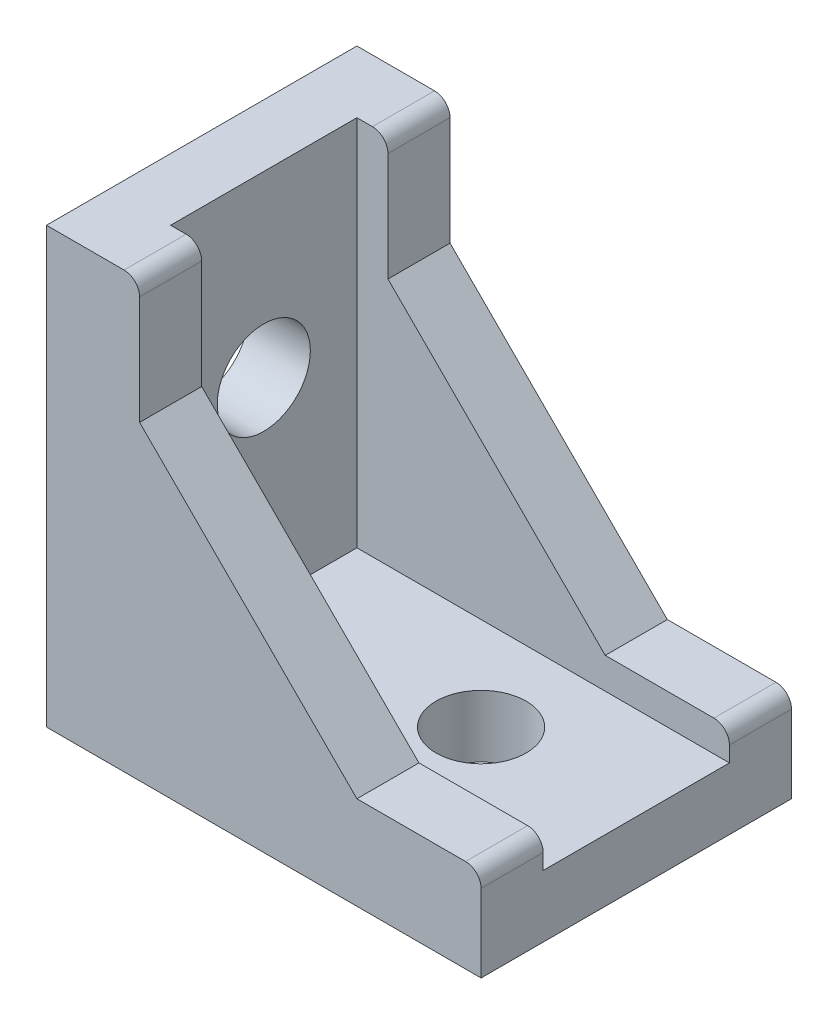
ISO-10303-21;
HEADER;
FILE_DESCRIPTION(('STEP AP214'),'2;1');
FILE_NAME('part.step','',(''),(''),'','','');
FILE_SCHEMA(('AUTOMOTIVE_DESIGN { 1 0 10303 214 1 1 1 1 }'));
ENDSEC;
DATA;
#1=APPLICATION_CONTEXT('core data for automotive mechanical design processes');
#2=APPLICATION_PROTOCOL_DEFINITION('international standard','automotive_design',2000,#1);
#3=PRODUCT_CONTEXT('',#1,'mechanical');
#4=PRODUCT('Part','Part','',(#3));
#5=PRODUCT_RELATED_PRODUCT_CATEGORY('part','',(#4));
#6=PRODUCT_DEFINITION_FORMATION('','',#4);
#7=PRODUCT_DEFINITION_CONTEXT('part definition',#1,'design');
#8=PRODUCT_DEFINITION('design','',#6,#7);
#9=PRODUCT_DEFINITION_SHAPE('','',#8);
#10=(LENGTH_UNIT() NAMED_UNIT(*) SI_UNIT(.MILLI.,.METRE.));
#11=(NAMED_UNIT(*) PLANE_ANGLE_UNIT() SI_UNIT($,.RADIAN.));
#12=(NAMED_UNIT(*) SI_UNIT($,.STERADIAN.) SOLID_ANGLE_UNIT());
#13=UNCERTAINTY_MEASURE_WITH_UNIT(LENGTH_MEASURE(1.E-05),#10,'distance_accuracy_value','');
#14=(GEOMETRIC_REPRESENTATION_CONTEXT(3) GLOBAL_UNCERTAINTY_ASSIGNED_CONTEXT((#13)) GLOBAL_UNIT_ASSIGNED_CONTEXT((#10,
#11,#12)) REPRESENTATION_CONTEXT('',''));
#15=CARTESIAN_POINT('',(0.,0.,0.));
#16=DIRECTION('',(0.,0.,1.));
#17=DIRECTION('',(1.,0.,0.));
#18=AXIS2_PLACEMENT_3D('',#15,#16,#17);
#19=CARTESIAN_POINT('',(2.88479240264605,9.4260494997986,20.0000000000002));
#20=DIRECTION('',(0.,-1.00000000000001,0.));
#21=DIRECTION('',(0.,0.,-1.));
#22=AXIS2_PLACEMENT_3D('',#19,#20,#21);
#23=PLANE('',#22);
#24=DIRECTION('',(-0.999999999999997,0.,0.));
#25=VECTOR('',#24,1.);
#26=CARTESIAN_POINT('',(2.88479240264605,9.4260494997986,20.0000000000002));
#27=LINE('',#26,#25);
#28=CARTESIAN_POINT('',(1.88479240264611,9.42604949979826,19.9999999999996));
#29=VERTEX_POINT('',#28);
#30=CARTESIAN_POINT('',(-5.1152075973539,9.4260494997986,19.9999999999996));
#31=VERTEX_POINT('',#30);
#32=EDGE_CURVE('E235',#29,#31,#27,.T.);
#33=ORIENTED_EDGE('',*,*,#32,.F.);
#34=DIRECTION('',(0.,0.,-1.));
#35=VECTOR('',#34,1.);
#36=CARTESIAN_POINT('',(1.88479240264611,9.42604949979826,19.9999999999996));
#37=LINE('',#36,#35);
#38=CARTESIAN_POINT('',(1.88479240264586,9.42604949979819,15.9999999999997));
#39=VERTEX_POINT('',#38);
#40=EDGE_CURVE('E13',#29,#39,#37,.T.);
#41=ORIENTED_EDGE('',*,*,#40,.T.);
#42=DIRECTION('',(0.999999999999997,0.,0.));
#43=VECTOR('',#42,1.);
#44=CARTESIAN_POINT('',(2.88479240264586,9.42604949979842,16.0000000000002));
#45=LINE('',#44,#43);
#46=CARTESIAN_POINT('',(-5.11520759735393,9.42604949979847,15.9999999999996));
#47=VERTEX_POINT('',#46);
#48=EDGE_CURVE('E208',#47,#39,#45,.T.);
#49=ORIENTED_EDGE('',*,*,#48,.F.);
#50=DIRECTION('',(0.,0.,-1.));
#51=VECTOR('',#50,1.);
#52=CARTESIAN_POINT('',(-5.1152075973539,9.4260494997986,19.9999999999996));
#53=LINE('',#52,#51);
#54=EDGE_CURVE('E262',#31,#47,#53,.T.);
#55=ORIENTED_EDGE('',*,*,#54,.F.);
#56=EDGE_LOOP('',(#33,#41,#49,#55));
#57=FACE_BOUND('',#56,.T.);
#58=ADVANCED_FACE('F47',(#57),#23,.F.);
#59=CARTESIAN_POINT('',(-5.1152075973539,9.4260494997986,19.9999999999996));
#60=DIRECTION('',(-0.707106781186544,-0.707106781186551,0.));
#61=DIRECTION('',(0.707106781186545,-0.707106781186551,0.));
#62=AXIS2_PLACEMENT_3D('',#59,#60,#61);
#63=PLANE('',#62);
#64=DIRECTION('',(0.707106781186545,-0.707106781186551,0.));
#65=VECTOR('',#64,1.);
#66=CARTESIAN_POINT('',(-5.11520759735393,9.42604949979847,15.9999999999996));
#67=LINE('',#66,#65);
#68=CARTESIAN_POINT('',(-19.1152075973532,23.4260494997984,15.9999999999998));
#69=VERTEX_POINT('',#68);
#70=EDGE_CURVE('E195',#69,#47,#67,.T.);
#71=ORIENTED_EDGE('',*,*,#70,.F.);
#72=DIRECTION('',(0.,0.,-1.));
#73=VECTOR('',#72,1.);
#74=CARTESIAN_POINT('',(-19.1152075973533,23.4260494997985,19.9999999999999));
#75=LINE('',#74,#73);
#76=CARTESIAN_POINT('',(-19.1152075973533,23.4260494997985,19.9999999999999));
#77=VERTEX_POINT('',#76);
#78=EDGE_CURVE('E258',#77,#69,#75,.T.);
#79=ORIENTED_EDGE('',*,*,#78,.F.);
#80=DIRECTION('',(-0.707106781186545,0.707106781186551,0.));
#81=VECTOR('',#80,1.);
#82=CARTESIAN_POINT('',(-5.1152075973539,9.4260494997986,19.9999999999996));
#83=LINE('',#82,#81);
#84=EDGE_CURVE('E237',#31,#77,#83,.T.);
#85=ORIENTED_EDGE('',*,*,#84,.F.);
#86=ORIENTED_EDGE('',*,*,#54,.T.);
#87=EDGE_LOOP('',(#71,#79,#85,#86));
#88=FACE_BOUND('',#87,.T.);
#89=ADVANCED_FACE('F362',(#88),#63,.F.);
#90=CARTESIAN_POINT('',(-19.1152075973533,23.4260494997985,19.9999999999999));
#91=DIRECTION('',(-0.999999999999997,0.,0.));
#92=DIRECTION('',(0.,0.,1.));
#93=AXIS2_PLACEMENT_3D('',#90,#91,#92);
#94=PLANE('',#93);
#95=DIRECTION('',(0.,-1.00000000000001,0.));
#96=VECTOR('',#95,1.);
#97=CARTESIAN_POINT('',(-19.1152075973532,23.4260494997984,15.9999999999998));
#98=LINE('',#97,#96);
#99=CARTESIAN_POINT('',(-19.1152075973533,30.4260494997983,15.9999999999996));
#100=VERTEX_POINT('',#99);
#101=EDGE_CURVE('E274',#100,#69,#98,.T.);
#102=ORIENTED_EDGE('',*,*,#101,.F.);
#103=DIRECTION('',(0.,0.,-1.));
#104=VECTOR('',#103,1.);
#105=CARTESIAN_POINT('',(-19.1152075973533,30.4260494997985,19.9999999999996));
#106=LINE('',#105,#104);
#107=CARTESIAN_POINT('',(-19.1152075973533,30.4260494997985,19.9999999999996));
#108=VERTEX_POINT('',#107);
#109=EDGE_CURVE('E301',#100,#108,#106,.F.);
#110=ORIENTED_EDGE('',*,*,#109,.T.);
#111=DIRECTION('',(0.,1.00000000000001,0.));
#112=VECTOR('',#111,1.);
#113=CARTESIAN_POINT('',(-19.1152075973533,23.4260494997985,19.9999999999999));
#114=LINE('',#113,#112);
#115=EDGE_CURVE('E239',#77,#108,#114,.T.);
#116=ORIENTED_EDGE('',*,*,#115,.F.);
#117=ORIENTED_EDGE('',*,*,#78,.T.);
#118=EDGE_LOOP('',(#102,#110,#116,#117));
#119=FACE_BOUND('',#118,.T.);
#120=ADVANCED_FACE('F357',(#119),#94,.F.);
#121=CARTESIAN_POINT('',(-19.1152075973533,31.4260494997985,20.0000000000001));
#122=DIRECTION('',(0.,-1.00000000000001,0.));
#123=DIRECTION('',(0.,0.,-1.));
#124=AXIS2_PLACEMENT_3D('',#121,#122,#123);
#125=PLANE('',#124);
#126=DIRECTION('',(0.999999999999997,0.,0.));
#127=VECTOR('',#126,1.);
#128=CARTESIAN_POINT('',(-19.1152075973533,31.4260494997989,4.));
#129=LINE('',#128,#127);
#130=CARTESIAN_POINT('',(-21.1152075973533,31.4260494997989,3.99999999999984));
#131=VERTEX_POINT('',#130);
#132=CARTESIAN_POINT('',(-20.1152075973533,31.4260494997989,4.00000000000011));
#133=VERTEX_POINT('',#132);
#134=EDGE_CURVE('E182',#131,#133,#129,.T.);
#135=ORIENTED_EDGE('',*,*,#134,.T.);
#136=DIRECTION('',(0.,0.,-1.));
#137=VECTOR('',#136,1.);
#138=CARTESIAN_POINT('',(-20.1152075973533,31.4260494997985,20.0000000000006));
#139=LINE('',#138,#137);
#140=CARTESIAN_POINT('',(-20.1152075973536,31.4260494997986,1.11022302462516E-13));
#141=VERTEX_POINT('',#140);
#142=EDGE_CURVE('E284',#133,#141,#139,.T.);
#143=ORIENTED_EDGE('',*,*,#142,.T.);
#144=DIRECTION('',(-0.999999999999997,0.,0.));
#145=VECTOR('',#144,1.);
#146=CARTESIAN_POINT('',(-19.1152075973536,31.4260494997984,-1.66533453693773E-13));
#147=LINE('',#146,#145);
#148=CARTESIAN_POINT('',(-25.1152075973536,31.4260494997986,-3.33066907387547E-13));
#149=VERTEX_POINT('',#148);
#150=EDGE_CURVE('E225',#141,#149,#147,.T.);
#151=ORIENTED_EDGE('',*,*,#150,.T.);
#152=DIRECTION('',(0.,0.,-1.));
#153=VECTOR('',#152,1.);
#154=CARTESIAN_POINT('',(-25.1152075973533,31.4260494997987,19.9999999999996));
#155=LINE('',#154,#153);
#156=CARTESIAN_POINT('',(-25.1152075973533,31.4260494997987,19.9999999999996));
#157=VERTEX_POINT('',#156);
#158=EDGE_CURVE('E271',#157,#149,#155,.T.);
#159=ORIENTED_EDGE('',*,*,#158,.F.);
#160=DIRECTION('',(-0.999999999999997,0.,0.));
#161=VECTOR('',#160,1.);
#162=CARTESIAN_POINT('',(-19.1152075973533,31.4260494997985,20.0000000000001));
#163=LINE('',#162,#161);
#164=CARTESIAN_POINT('',(-20.1152075973533,31.4260494997985,20.0000000000006));
#165=VERTEX_POINT('',#164);
#166=EDGE_CURVE('E226',#165,#157,#163,.T.);
#167=ORIENTED_EDGE('',*,*,#166,.F.);
#168=DIRECTION('',(0.,0.,-1.));
#169=VECTOR('',#168,1.);
#170=CARTESIAN_POINT('',(-20.1152075973533,31.4260494997985,20.0000000000006));
#171=LINE('',#170,#169);
#172=CARTESIAN_POINT('',(-20.1152075973534,31.4260494997986,16.0000000000003));
#173=VERTEX_POINT('',#172);
#174=EDGE_CURVE('E281',#165,#173,#171,.T.);
#175=ORIENTED_EDGE('',*,*,#174,.T.);
#176=DIRECTION('',(0.999999999999997,0.,0.));
#177=VECTOR('',#176,1.);
#178=CARTESIAN_POINT('',(-19.1152075973534,31.4260494997986,16.0000000000001));
#179=LINE('',#178,#177);
#180=CARTESIAN_POINT('',(-21.1152075973534,31.4260494997986,16.0000000000002));
#181=VERTEX_POINT('',#180);
#182=EDGE_CURVE('E213',#181,#173,#179,.T.);
#183=ORIENTED_EDGE('',*,*,#182,.F.);
#184=DIRECTION('',(0.,0.,-1.));
#185=VECTOR('',#184,1.);
#186=CARTESIAN_POINT('',(-21.1152075973533,31.4260494997985,20.0000000000002));
#187=LINE('',#186,#185);
#188=EDGE_CURVE('E279',#181,#131,#187,.T.);
#189=ORIENTED_EDGE('',*,*,#188,.T.);
#190=EDGE_LOOP('',(#135,#143,#151,#159,#167,#175,#183,#189));
#191=FACE_BOUND('',#190,.T.);
#192=ADVANCED_FACE('F337',(#191),#125,.F.);
#193=CARTESIAN_POINT('',(-25.1152075973533,31.4260494997987,19.9999999999996));
#194=DIRECTION('',(0.999999999999997,0.,0.));
#195=DIRECTION('',(0.,1.00000000000001,0.));
#196=AXIS2_PLACEMENT_3D('',#193,#194,#195);
#197=PLANE('',#196);
#198=CARTESIAN_POINT('',(-25.1152075973533,19.9260494997982,9.99999999999923));
#199=DIRECTION('',(0.999999999999997,0.,0.));
#200=DIRECTION('',(0.,1.00000000000001,0.));
#201=AXIS2_PLACEMENT_3D('',#198,#199,#200);
#202=CIRCLE('',#201,3.);
#203=CARTESIAN_POINT('',(-25.1152075973533,19.9260494997982,6.9999999999994));
#204=VERTEX_POINT('',#203);
#205=EDGE_CURVE('E205',#204,#204,#202,.T.);
#206=ORIENTED_EDGE('',*,*,#205,.T.);
#207=EDGE_LOOP('',(#206));
#208=FACE_BOUND('',#207,.T.);
#209=DIRECTION('',(0.,-1.00000000000001,0.));
#210=VECTOR('',#209,1.);
#211=CARTESIAN_POINT('',(-25.1152075973536,31.4260494997986,-3.33066907387547E-13));
#212=LINE('',#211,#210);
#213=CARTESIAN_POINT('',(-25.1152075973539,3.42604949979802,-7.7715611723761E-13));
#214=VERTEX_POINT('',#213);
#215=EDGE_CURVE('E244',#149,#214,#212,.T.);
#216=ORIENTED_EDGE('',*,*,#215,.T.);
#217=DIRECTION('',(0.,0.,-1.));
#218=VECTOR('',#217,1.);
#219=CARTESIAN_POINT('',(-25.1152075973536,3.42604949979816,19.9999999999991));
#220=LINE('',#219,#218);
#221=CARTESIAN_POINT('',(-25.1152075973536,3.42604949979816,19.9999999999991));
#222=VERTEX_POINT('',#221);
#223=EDGE_CURVE('E268',#222,#214,#220,.T.);
#224=ORIENTED_EDGE('',*,*,#223,.F.);
#225=DIRECTION('',(0.,-1.00000000000001,0.));
#226=VECTOR('',#225,1.);
#227=CARTESIAN_POINT('',(-25.1152075973533,31.4260494997987,19.9999999999996));
#228=LINE('',#227,#226);
#229=EDGE_CURVE('E228',#157,#222,#228,.T.);
#230=ORIENTED_EDGE('',*,*,#229,.F.);
#231=ORIENTED_EDGE('',*,*,#158,.T.);
#232=EDGE_LOOP('',(#216,#224,#230,#231));
#233=FACE_BOUND('',#232,.T.);
#234=ADVANCED_FACE('F344',(#208,#233),#197,.F.);
#235=CARTESIAN_POINT('',(-25.1152075973536,3.42604949979816,19.9999999999991));
#236=DIRECTION('',(0.,1.00000000000001,0.));
#237=DIRECTION('',(0.,0.,1.));
#238=AXIS2_PLACEMENT_3D('',#235,#236,#237);
#239=PLANE('',#238);
#240=CARTESIAN_POINT('',(-7.11520759735376,3.42604949979819,9.9999999999994));
#241=DIRECTION('',(0.,1.00000000000001,0.));
#242=DIRECTION('',(0.,0.,1.));
#243=AXIS2_PLACEMENT_3D('',#240,#241,#242);
#244=CIRCLE('',#243,2.9);
#245=CARTESIAN_POINT('',(-7.11520759735376,3.42604949979819,12.8999999999994));
#246=VERTEX_POINT('',#245);
#247=EDGE_CURVE('E509',#246,#246,#244,.T.);
#248=ORIENTED_EDGE('',*,*,#247,.T.);
#249=EDGE_LOOP('',(#248));
#250=FACE_BOUND('',#249,.T.);
#251=DIRECTION('',(0.999999999999997,0.,0.));
#252=VECTOR('',#251,1.);
#253=CARTESIAN_POINT('',(-25.1152075973539,3.42604949979802,-7.7715611723761E-13));
#254=LINE('',#253,#252);
#255=CARTESIAN_POINT('',(2.88479240264627,3.42604949979886,1.11022302462516E-13));
#256=VERTEX_POINT('',#255);
#257=EDGE_CURVE('E246',#214,#256,#254,.T.);
#258=ORIENTED_EDGE('',*,*,#257,.T.);
#259=DIRECTION('',(0.,0.,-1.));
#260=VECTOR('',#259,1.);
#261=CARTESIAN_POINT('',(2.8847924026463,3.42604949979849,20.0000000000002));
#262=LINE('',#261,#260);
#263=CARTESIAN_POINT('',(2.8847924026463,3.42604949979849,20.0000000000002));
#264=VERTEX_POINT('',#263);
#265=EDGE_CURVE('E265',#264,#256,#262,.T.);
#266=ORIENTED_EDGE('',*,*,#265,.F.);
#267=DIRECTION('',(0.999999999999997,0.,0.));
#268=VECTOR('',#267,1.);
#269=CARTESIAN_POINT('',(-25.1152075973536,3.42604949979816,19.9999999999991));
#270=LINE('',#269,#268);
#271=EDGE_CURVE('E231',#222,#264,#270,.T.);
#272=ORIENTED_EDGE('',*,*,#271,.F.);
#273=ORIENTED_EDGE('',*,*,#223,.T.);
#274=EDGE_LOOP('',(#258,#266,#272,#273));
#275=FACE_BOUND('',#274,.T.);
#276=ADVANCED_FACE('F385',(#250,#275),#239,.F.);
#277=CARTESIAN_POINT('',(2.8847924026463,3.42604949979849,20.0000000000002));
#278=DIRECTION('',(-0.999999999999997,0.,0.));
#279=DIRECTION('',(0.,0.,1.));
#280=AXIS2_PLACEMENT_3D('',#277,#278,#279);
#281=PLANE('',#280);
#282=DIRECTION('',(0.,1.00000000000001,0.));
#283=VECTOR('',#282,1.);
#284=CARTESIAN_POINT('',(2.88479240264627,3.42604949979886,1.11022302462516E-13));
#285=LINE('',#284,#283);
#286=CARTESIAN_POINT('',(2.88479240264627,8.42604949979886,1.66533453693773E-13));
#287=VERTEX_POINT('',#286);
#288=EDGE_CURVE('E248',#256,#287,#285,.T.);
#289=ORIENTED_EDGE('',*,*,#288,.T.);
#290=DIRECTION('',(0.,0.,-1.));
#291=VECTOR('',#290,1.);
#292=CARTESIAN_POINT('',(2.88479240264611,8.4260494997986,20.0000000000005));
#293=LINE('',#292,#291);
#294=CARTESIAN_POINT('',(2.88479240264605,8.42604949979911,4.00000000000017));
#295=VERTEX_POINT('',#294);
#296=EDGE_CURVE('E55',#287,#295,#293,.F.);
#297=ORIENTED_EDGE('',*,*,#296,.T.);
#298=DIRECTION('',(0.,-1.00000000000001,0.));
#299=VECTOR('',#298,1.);
#300=CARTESIAN_POINT('',(2.88479240264627,3.42604949979888,4.00000000000011));
#301=LINE('',#300,#299);
#302=CARTESIAN_POINT('',(2.88479240264589,7.426049499799,4.00000000000011));
#303=VERTEX_POINT('',#302);
#304=EDGE_CURVE('E222',#295,#303,#301,.T.);
#305=ORIENTED_EDGE('',*,*,#304,.T.);
#306=DIRECTION('',(0.,0.,1.));
#307=VECTOR('',#306,1.);
#308=CARTESIAN_POINT('',(2.88479240264608,7.4260494997985,20.0000000000005));
#309=LINE('',#308,#307);
#310=CARTESIAN_POINT('',(2.88479240264586,7.42604949979841,16.0000000000005));
#311=VERTEX_POINT('',#310);
#312=EDGE_CURVE('E200',#303,#311,#309,.T.);
#313=ORIENTED_EDGE('',*,*,#312,.T.);
#314=DIRECTION('',(0.,-1.00000000000001,0.));
#315=VECTOR('',#314,1.);
#316=CARTESIAN_POINT('',(2.8847924026463,3.42604949979847,15.9999999999998));
#317=LINE('',#316,#315);
#318=CARTESIAN_POINT('',(2.88479240264608,8.42604949979842,16.0000000000005));
#319=VERTEX_POINT('',#318);
#320=EDGE_CURVE('E211',#319,#311,#317,.T.);
#321=ORIENTED_EDGE('',*,*,#320,.F.);
#322=DIRECTION('',(0.,0.,-1.));
#323=VECTOR('',#322,1.);
#324=CARTESIAN_POINT('',(2.88479240264611,8.4260494997986,20.0000000000005));
#325=LINE('',#324,#323);
#326=CARTESIAN_POINT('',(2.88479240264611,8.4260494997986,20.0000000000005));
#327=VERTEX_POINT('',#326);
#328=EDGE_CURVE('E70',#319,#327,#325,.F.);
#329=ORIENTED_EDGE('',*,*,#328,.T.);
#330=DIRECTION('',(0.,1.00000000000001,0.));
#331=VECTOR('',#330,1.);
#332=CARTESIAN_POINT('',(2.8847924026463,3.42604949979849,20.0000000000002));
#333=LINE('',#332,#331);
#334=EDGE_CURVE('E233',#264,#327,#333,.T.);
#335=ORIENTED_EDGE('',*,*,#334,.F.);
#336=ORIENTED_EDGE('',*,*,#265,.T.);
#337=EDGE_LOOP('',(#289,#297,#305,#313,#321,#329,#335,#336));
#338=FACE_BOUND('',#337,.T.);
#339=ADVANCED_FACE('F310',(#338),#281,.F.);
#340=DIRECTION('',(0.999999999999997,0.,0.));
#341=VECTOR('',#340,1.);
#342=CARTESIAN_POINT('',(2.88479240264611,9.42604949979911,4.00000000000011));
#343=LINE('',#342,#341);
#344=CARTESIAN_POINT('',(-5.1152075973539,9.42604949979899,3.99999999999917));
#345=VERTEX_POINT('',#344);
#346=CARTESIAN_POINT('',(1.88479240264611,9.42604949979889,3.99999999999967));
#347=VERTEX_POINT('',#346);
#348=EDGE_CURVE('E219',#345,#347,#343,.T.);
#349=ORIENTED_EDGE('',*,*,#348,.T.);
#350=DIRECTION('',(0.,0.,-1.));
#351=VECTOR('',#350,1.);
#352=CARTESIAN_POINT('',(1.88479240264611,9.42604949979826,19.9999999999996));
#353=LINE('',#352,#351);
#354=CARTESIAN_POINT('',(1.88479240264633,9.42604949979864,-3.33066907387547E-13));
#355=VERTEX_POINT('',#354);
#356=EDGE_CURVE('E306',#347,#355,#353,.T.);
#357=ORIENTED_EDGE('',*,*,#356,.T.);
#358=DIRECTION('',(-0.999999999999997,0.,0.));
#359=VECTOR('',#358,1.);
#360=CARTESIAN_POINT('',(2.8847924026465,9.42604949979886,0.));
#361=LINE('',#360,#359);
#362=CARTESIAN_POINT('',(-5.11520759735368,9.42604949979803,-8.32667268468867E-13));
#363=VERTEX_POINT('',#362);
#364=EDGE_CURVE('E251',#355,#363,#361,.T.);
#365=ORIENTED_EDGE('',*,*,#364,.T.);
#366=EDGE_CURVE('E261',#345,#363,#53,.T.);
#367=ORIENTED_EDGE('',*,*,#366,.F.);
#368=EDGE_LOOP('',(#349,#357,#365,#367));
#369=FACE_BOUND('',#368,.T.);
#370=ADVANCED_FACE('F318',(#369),#23,.F.);
#371=CARTESIAN_POINT('',(-19.1152075973537,23.4260494997991,3.99999999999984));
#372=VERTEX_POINT('',#371);
#373=CARTESIAN_POINT('',(-19.1152075973538,23.4260494997986,-1.66533453693773E-13));
#374=VERTEX_POINT('',#373);
#375=EDGE_CURVE('E242',#372,#374,#75,.T.);
#376=ORIENTED_EDGE('',*,*,#375,.F.);
#377=DIRECTION('',(0.707106781186545,-0.707106781186551,0.));
#378=VECTOR('',#377,1.);
#379=CARTESIAN_POINT('',(-5.1152075973539,9.42604949979899,3.99999999999917));
#380=LINE('',#379,#378);
#381=EDGE_CURVE('E216',#372,#345,#380,.T.);
#382=ORIENTED_EDGE('',*,*,#381,.T.);
#383=ORIENTED_EDGE('',*,*,#366,.T.);
#384=DIRECTION('',(-0.707106781186545,0.707106781186551,0.));
#385=VECTOR('',#384,1.);
#386=CARTESIAN_POINT('',(-5.11520759735368,9.42604949979803,-8.32667268468867E-13));
#387=LINE('',#386,#385);
#388=EDGE_CURVE('E253',#363,#374,#387,.T.);
#389=ORIENTED_EDGE('',*,*,#388,.T.);
#390=EDGE_LOOP('',(#376,#382,#383,#389));
#391=FACE_BOUND('',#390,.T.);
#392=ADVANCED_FACE('F328',(#391),#63,.F.);
#393=DIRECTION('',(0.,1.00000000000001,0.));
#394=VECTOR('',#393,1.);
#395=CARTESIAN_POINT('',(-19.1152075973538,23.4260494997986,-1.66533453693773E-13));
#396=LINE('',#395,#394);
#397=CARTESIAN_POINT('',(-19.1152075973538,30.4260494997985,-5.55111512312578E-13));
#398=VERTEX_POINT('',#397);
#399=EDGE_CURVE('E229',#374,#398,#396,.T.);
#400=ORIENTED_EDGE('',*,*,#399,.T.);
#401=DIRECTION('',(0.,0.,-1.));
#402=VECTOR('',#401,1.);
#403=CARTESIAN_POINT('',(-19.1152075973533,30.4260494997985,19.9999999999996));
#404=LINE('',#403,#402);
#405=CARTESIAN_POINT('',(-19.1152075973533,30.426049499799,3.99999999999945));
#406=VERTEX_POINT('',#405);
#407=EDGE_CURVE('E291',#398,#406,#404,.F.);
#408=ORIENTED_EDGE('',*,*,#407,.T.);
#409=DIRECTION('',(0.,-1.00000000000001,0.));
#410=VECTOR('',#409,1.);
#411=CARTESIAN_POINT('',(-19.1152075973537,23.4260494997991,3.99999999999984));
#412=LINE('',#411,#410);
#413=EDGE_CURVE('E276',#406,#372,#412,.T.);
#414=ORIENTED_EDGE('',*,*,#413,.T.);
#415=ORIENTED_EDGE('',*,*,#375,.T.);
#416=EDGE_LOOP('',(#400,#408,#414,#415));
#417=FACE_BOUND('',#416,.T.);
#418=ADVANCED_FACE('F384',(#417),#94,.F.);
#419=CARTESIAN_POINT('',(-1.38777878078145E-13,-1.66533453693773E-13,20.));
#420=DIRECTION('',(0.,0.,1.));
#421=DIRECTION('',(0.999999999999997,0.,0.));
#422=AXIS2_PLACEMENT_3D('',#419,#420,#421);
#423=PLANE('',#422);
#424=ORIENTED_EDGE('',*,*,#115,.T.);
#425=CARTESIAN_POINT('',(-20.1152075973533,30.4260494997983,19.9999999999997));
#426=DIRECTION('',(0.,0.,1.));
#427=DIRECTION('',(0.999999999999997,0.,0.));
#428=AXIS2_PLACEMENT_3D('',#425,#426,#427);
#429=CIRCLE('',#428,1.);
#430=EDGE_CURVE('E304',#108,#165,#429,.T.);
#431=ORIENTED_EDGE('',*,*,#430,.T.);
#432=ORIENTED_EDGE('',*,*,#166,.T.);
#433=ORIENTED_EDGE('',*,*,#229,.T.);
#434=ORIENTED_EDGE('',*,*,#271,.T.);
#435=ORIENTED_EDGE('',*,*,#334,.T.);
#436=CARTESIAN_POINT('',(1.88479240264636,8.42604949979826,20.));
#437=DIRECTION('',(0.,0.,1.));
#438=DIRECTION('',(0.999999999999997,0.,0.));
#439=AXIS2_PLACEMENT_3D('',#436,#437,#438);
#440=CIRCLE('',#439,1.);
#441=EDGE_CURVE('E62',#327,#29,#440,.T.);
#442=ORIENTED_EDGE('',*,*,#441,.T.);
#443=ORIENTED_EDGE('',*,*,#32,.T.);
#444=ORIENTED_EDGE('',*,*,#84,.T.);
#445=EDGE_LOOP('',(#424,#431,#432,#433,#434,#435,#442,#443,#444));
#446=FACE_BOUND('',#445,.T.);
#447=ADVANCED_FACE('F460',(#446),#423,.T.);
#448=CARTESIAN_POINT('',(0.,0.,0.));
#449=DIRECTION('',(0.,0.,1.));
#450=DIRECTION('',(0.999999999999997,0.,0.));
#451=AXIS2_PLACEMENT_3D('',#448,#449,#450);
#452=PLANE('',#451);
#453=ORIENTED_EDGE('',*,*,#150,.F.);
#454=CARTESIAN_POINT('',(-20.1152075973538,30.4260494997986,-3.33066907387547E-13));
#455=DIRECTION('',(0.,0.,1.));
#456=DIRECTION('',(0.999999999999997,0.,0.));
#457=AXIS2_PLACEMENT_3D('',#454,#455,#456);
#458=CIRCLE('',#457,1.);
#459=EDGE_CURVE('E289',#141,#398,#458,.F.);
#460=ORIENTED_EDGE('',*,*,#459,.T.);
#461=ORIENTED_EDGE('',*,*,#399,.F.);
#462=ORIENTED_EDGE('',*,*,#388,.F.);
#463=ORIENTED_EDGE('',*,*,#364,.F.);
#464=CARTESIAN_POINT('',(1.88479240264627,8.42604949979869,-1.11022302462516E-13));
#465=DIRECTION('',(0.,0.,1.));
#466=DIRECTION('',(0.999999999999997,0.,0.));
#467=AXIS2_PLACEMENT_3D('',#464,#465,#466);
#468=CIRCLE('',#467,1.);
#469=EDGE_CURVE('E287',#355,#287,#468,.F.);
#470=ORIENTED_EDGE('',*,*,#469,.T.);
#471=ORIENTED_EDGE('',*,*,#288,.F.);
#472=ORIENTED_EDGE('',*,*,#257,.F.);
#473=ORIENTED_EDGE('',*,*,#215,.F.);
#474=EDGE_LOOP('',(#453,#460,#461,#462,#463,#470,#471,#472,#473));
#475=FACE_BOUND('',#474,.T.);
#476=ADVANCED_FACE('F324',(#475),#452,.F.);
#477=CARTESIAN_POINT('',(-21.1152075973537,7.4260494997985,3.99999999999956));
#478=DIRECTION('',(-0.999999999999997,0.,0.));
#479=DIRECTION('',(0.,0.,1.));
#480=AXIS2_PLACEMENT_3D('',#477,#478,#479);
#481=PLANE('',#480);
#482=CARTESIAN_POINT('',(-21.1152075973533,19.9260494997982,9.99999999999962));
#483=DIRECTION('',(0.999999999999997,0.,0.));
#484=DIRECTION('',(0.,0.,-1.));
#485=AXIS2_PLACEMENT_3D('',#482,#483,#484);
#486=CIRCLE('',#485,3.);
#487=CARTESIAN_POINT('',(-21.1152075973533,19.9260494997982,6.99999999999941));
#488=VERTEX_POINT('',#487);
#489=EDGE_CURVE('E508',#488,#488,#486,.T.);
#490=ORIENTED_EDGE('',*,*,#489,.F.);
#491=EDGE_LOOP('',(#490));
#492=FACE_BOUND('',#491,.T.);
#493=DIRECTION('',(0.,-1.00000000000001,0.));
#494=VECTOR('',#493,1.);
#495=CARTESIAN_POINT('',(-21.1152075973537,7.42604949979864,15.9999999999996));
#496=LINE('',#495,#494);
#497=CARTESIAN_POINT('',(-21.1152075973537,7.42604949979864,15.9999999999996));
#498=VERTEX_POINT('',#497);
#499=EDGE_CURVE('E191',#181,#498,#496,.T.);
#500=ORIENTED_EDGE('',*,*,#499,.T.);
#501=DIRECTION('',(0.,0.,1.));
#502=VECTOR('',#501,1.);
#503=CARTESIAN_POINT('',(-21.1152075973537,7.4260494997985,3.99999999999956));
#504=LINE('',#503,#502);
#505=CARTESIAN_POINT('',(-21.1152075973537,7.4260494997985,3.99999999999956));
#506=VERTEX_POINT('',#505);
#507=EDGE_CURVE('E188',#506,#498,#504,.T.);
#508=ORIENTED_EDGE('',*,*,#507,.F.);
#509=DIRECTION('',(0.,-1.00000000000001,0.));
#510=VECTOR('',#509,1.);
#511=CARTESIAN_POINT('',(-21.1152075973537,7.4260494997985,3.99999999999956));
#512=LINE('',#511,#510);
#513=EDGE_CURVE('E174',#131,#506,#512,.T.);
#514=ORIENTED_EDGE('',*,*,#513,.F.);
#515=ORIENTED_EDGE('',*,*,#188,.F.);
#516=EDGE_LOOP('',(#500,#508,#514,#515));
#517=FACE_BOUND('',#516,.T.);
#518=ADVANCED_FACE('F189',(#492,#517),#481,.F.);
#519=CARTESIAN_POINT('',(15.2712862387925,7.42604949979886,3.99999999999984));
#520=DIRECTION('',(0.,-1.00000000000001,0.));
#521=DIRECTION('',(0.999999999999997,0.,0.));
#522=AXIS2_PLACEMENT_3D('',#519,#520,#521);
#523=PLANE('',#522);
#524=CARTESIAN_POINT('',(-7.11520759735354,7.42604949979833,9.9999999999994));
#525=DIRECTION('',(0.,1.00000000000001,0.));
#526=DIRECTION('',(-0.999999999999997,0.,0.));
#527=AXIS2_PLACEMENT_3D('',#524,#525,#526);
#528=CIRCLE('',#527,2.9);
#529=CARTESIAN_POINT('',(-10.0152075973535,7.42604949979833,9.99999999999939));
#530=VERTEX_POINT('',#529);
#531=EDGE_CURVE('E513',#530,#530,#528,.T.);
#532=ORIENTED_EDGE('',*,*,#531,.F.);
#533=EDGE_LOOP('',(#532));
#534=FACE_BOUND('',#533,.T.);
#535=DIRECTION('',(0.999999999999997,0.,0.));
#536=VECTOR('',#535,1.);
#537=CARTESIAN_POINT('',(15.2712862387925,7.42604949979886,3.99999999999984));
#538=LINE('',#537,#536);
#539=EDGE_CURVE('E180',#506,#303,#538,.T.);
#540=ORIENTED_EDGE('',*,*,#539,.F.);
#541=ORIENTED_EDGE('',*,*,#507,.T.);
#542=DIRECTION('',(0.999999999999997,0.,0.));
#543=VECTOR('',#542,1.);
#544=CARTESIAN_POINT('',(15.2712862387925,7.42604949979817,15.9999999999998));
#545=LINE('',#544,#543);
#546=EDGE_CURVE('E185',#498,#311,#545,.T.);
#547=ORIENTED_EDGE('',*,*,#546,.T.);
#548=ORIENTED_EDGE('',*,*,#312,.F.);
#549=EDGE_LOOP('',(#540,#541,#547,#548));
#550=FACE_BOUND('',#549,.T.);
#551=ADVANCED_FACE('F198',(#534,#550),#523,.F.);
#552=CARTESIAN_POINT('',(0.,1.66533453693773E-13,4.));
#553=DIRECTION('',(0.,0.,-1.));
#554=DIRECTION('',(-0.999999999999997,0.,0.));
#555=AXIS2_PLACEMENT_3D('',#552,#553,#554);
#556=PLANE('',#555);
#557=ORIENTED_EDGE('',*,*,#413,.F.);
#558=CARTESIAN_POINT('',(-20.1152075973533,30.4260494997989,3.99999999999967));
#559=DIRECTION('',(0.,0.,-1.));
#560=DIRECTION('',(-0.999999999999997,0.,0.));
#561=AXIS2_PLACEMENT_3D('',#558,#559,#560);
#562=CIRCLE('',#561,1.);
#563=EDGE_CURVE('E295',#406,#133,#562,.F.);
#564=ORIENTED_EDGE('',*,*,#563,.T.);
#565=ORIENTED_EDGE('',*,*,#134,.F.);
#566=ORIENTED_EDGE('',*,*,#513,.T.);
#567=ORIENTED_EDGE('',*,*,#539,.T.);
#568=ORIENTED_EDGE('',*,*,#304,.F.);
#569=CARTESIAN_POINT('',(1.88479240264605,8.426049499799,3.99999999999989));
#570=DIRECTION('',(0.,0.,-1.));
#571=DIRECTION('',(-0.999999999999997,0.,0.));
#572=AXIS2_PLACEMENT_3D('',#569,#570,#571);
#573=CIRCLE('',#572,1.);
#574=EDGE_CURVE('E293',#295,#347,#573,.F.);
#575=ORIENTED_EDGE('',*,*,#574,.T.);
#576=ORIENTED_EDGE('',*,*,#348,.F.);
#577=ORIENTED_EDGE('',*,*,#381,.F.);
#578=EDGE_LOOP('',(#557,#564,#565,#566,#567,#568,#575,#576,#577));
#579=FACE_BOUND('',#578,.T.);
#580=ADVANCED_FACE('F177',(#579),#556,.F.);
#581=CARTESIAN_POINT('',(-1.94289029309402E-13,-3.88578058618805E-13,16.));
#582=DIRECTION('',(0.,0.,-1.));
#583=DIRECTION('',(-0.999999999999997,0.,0.));
#584=AXIS2_PLACEMENT_3D('',#581,#582,#583);
#585=PLANE('',#584);
#586=ORIENTED_EDGE('',*,*,#182,.T.);
#587=CARTESIAN_POINT('',(-20.1152075973533,30.4260494997983,15.9999999999995));
#588=DIRECTION('',(0.,0.,-1.));
#589=DIRECTION('',(-0.999999999999997,0.,0.));
#590=AXIS2_PLACEMENT_3D('',#587,#588,#589);
#591=CIRCLE('',#590,1.);
#592=EDGE_CURVE('E299',#173,#100,#591,.T.);
#593=ORIENTED_EDGE('',*,*,#592,.T.);
#594=ORIENTED_EDGE('',*,*,#101,.T.);
#595=ORIENTED_EDGE('',*,*,#70,.T.);
#596=ORIENTED_EDGE('',*,*,#48,.T.);
#597=CARTESIAN_POINT('',(1.88479240264608,8.42604949979819,16.0000000000001));
#598=DIRECTION('',(0.,0.,-1.));
#599=DIRECTION('',(-0.999999999999997,0.,0.));
#600=AXIS2_PLACEMENT_3D('',#597,#598,#599);
#601=CIRCLE('',#600,1.);
#602=EDGE_CURVE('E297',#39,#319,#601,.T.);
#603=ORIENTED_EDGE('',*,*,#602,.T.);
#604=ORIENTED_EDGE('',*,*,#320,.T.);
#605=ORIENTED_EDGE('',*,*,#546,.F.);
#606=ORIENTED_EDGE('',*,*,#499,.F.);
#607=EDGE_LOOP('',(#586,#593,#594,#595,#596,#603,#604,#605,#606));
#608=FACE_BOUND('',#607,.T.);
#609=ADVANCED_FACE('F354',(#608),#585,.T.);
#610=CARTESIAN_POINT('',(-33.1152075973539,19.9260494997982,9.9999999999994));
#611=DIRECTION('',(0.999999999999997,0.,0.));
#612=DIRECTION('',(0.,0.,-1.));
#613=AXIS2_PLACEMENT_3D('',#610,#611,#612);
#614=CYLINDRICAL_SURFACE('',#613,3.);
#615=CARTESIAN_POINT('',(-21.1152075973533,19.9260494997982,6.99999999999941));
#616=CARTESIAN_POINT('',(-21.15687426402,19.9260494997982,6.99999999999941));
#617=CARTESIAN_POINT('',(-21.1985409306867,19.9260494997982,6.99999999999941));
#618=CARTESIAN_POINT('',(-21.28187426402,19.9260494997982,6.99999999999941));
#619=CARTESIAN_POINT('',(-21.3235409306867,19.9260494997982,6.99999999999941));
#620=CARTESIAN_POINT('',(-21.40687426402,19.9260494997982,6.99999999999941));
#621=CARTESIAN_POINT('',(-21.4485409306867,19.9260494997982,6.99999999999941));
#622=CARTESIAN_POINT('',(-21.53187426402,19.9260494997982,6.99999999999941));
#623=CARTESIAN_POINT('',(-21.5735409306867,19.9260494997982,6.99999999999941));
#624=CARTESIAN_POINT('',(-21.65687426402,19.9260494997982,6.99999999999941));
#625=CARTESIAN_POINT('',(-21.6985409306867,19.9260494997982,6.99999999999941));
#626=CARTESIAN_POINT('',(-21.78187426402,19.9260494997982,6.99999999999941));
#627=CARTESIAN_POINT('',(-21.8235409306867,19.9260494997982,6.99999999999941));
#628=CARTESIAN_POINT('',(-21.90687426402,19.9260494997982,6.99999999999941));
#629=CARTESIAN_POINT('',(-21.9485409306867,19.9260494997982,6.99999999999941));
#630=CARTESIAN_POINT('',(-22.03187426402,19.9260494997982,6.99999999999941));
#631=CARTESIAN_POINT('',(-22.0735409306867,19.9260494997982,6.99999999999941));
#632=CARTESIAN_POINT('',(-22.15687426402,19.9260494997982,6.99999999999941));
#633=CARTESIAN_POINT('',(-22.1985409306867,19.9260494997982,6.99999999999941));
#634=CARTESIAN_POINT('',(-22.28187426402,19.9260494997982,6.99999999999941));
#635=CARTESIAN_POINT('',(-22.3235409306867,19.9260494997982,6.99999999999941));
#636=CARTESIAN_POINT('',(-22.40687426402,19.9260494997982,6.99999999999941));
#637=CARTESIAN_POINT('',(-22.4485409306867,19.9260494997982,6.99999999999941));
#638=CARTESIAN_POINT('',(-22.53187426402,19.9260494997982,6.99999999999941));
#639=CARTESIAN_POINT('',(-22.5735409306867,19.9260494997982,6.99999999999941));
#640=CARTESIAN_POINT('',(-22.65687426402,19.9260494997982,6.99999999999941));
#641=CARTESIAN_POINT('',(-22.6985409306867,19.9260494997982,6.99999999999941));
#642=CARTESIAN_POINT('',(-22.78187426402,19.9260494997982,6.99999999999941));
#643=CARTESIAN_POINT('',(-22.8235409306867,19.9260494997982,6.99999999999941));
#644=CARTESIAN_POINT('',(-22.90687426402,19.9260494997982,6.99999999999941));
#645=CARTESIAN_POINT('',(-22.9485409306867,19.9260494997982,6.99999999999941));
#646=CARTESIAN_POINT('',(-23.03187426402,19.9260494997982,6.99999999999941));
#647=CARTESIAN_POINT('',(-23.0735409306867,19.9260494997982,6.99999999999941));
#648=CARTESIAN_POINT('',(-23.15687426402,19.9260494997982,6.99999999999941));
#649=CARTESIAN_POINT('',(-23.1985409306867,19.9260494997982,6.99999999999941));
#650=CARTESIAN_POINT('',(-23.28187426402,19.9260494997982,6.99999999999941));
#651=CARTESIAN_POINT('',(-23.3235409306867,19.9260494997982,6.99999999999941));
#652=CARTESIAN_POINT('',(-23.40687426402,19.9260494997982,6.99999999999941));
#653=CARTESIAN_POINT('',(-23.4485409306867,19.9260494997982,6.99999999999941));
#654=CARTESIAN_POINT('',(-23.53187426402,19.9260494997982,6.99999999999941));
#655=CARTESIAN_POINT('',(-23.5735409306867,19.9260494997982,6.99999999999941));
#656=CARTESIAN_POINT('',(-23.65687426402,19.9260494997982,6.99999999999941));
#657=CARTESIAN_POINT('',(-23.6985409306867,19.9260494997982,6.9999999999994));
#658=CARTESIAN_POINT('',(-23.78187426402,19.9260494997982,6.9999999999994));
#659=CARTESIAN_POINT('',(-23.8235409306867,19.9260494997982,6.9999999999994));
#660=CARTESIAN_POINT('',(-23.90687426402,19.9260494997982,6.9999999999994));
#661=CARTESIAN_POINT('',(-23.9485409306867,19.9260494997982,6.9999999999994));
#662=CARTESIAN_POINT('',(-24.03187426402,19.9260494997982,6.9999999999994));
#663=CARTESIAN_POINT('',(-24.0735409306867,19.9260494997982,6.9999999999994));
#664=CARTESIAN_POINT('',(-24.15687426402,19.9260494997982,6.9999999999994));
#665=CARTESIAN_POINT('',(-24.1985409306867,19.9260494997982,6.9999999999994));
#666=CARTESIAN_POINT('',(-24.28187426402,19.9260494997982,6.9999999999994));
#667=CARTESIAN_POINT('',(-24.3235409306867,19.9260494997982,6.9999999999994));
#668=CARTESIAN_POINT('',(-24.40687426402,19.9260494997982,6.9999999999994));
#669=CARTESIAN_POINT('',(-24.4485409306867,19.9260494997982,6.9999999999994));
#670=CARTESIAN_POINT('',(-24.53187426402,19.9260494997982,6.9999999999994));
#671=CARTESIAN_POINT('',(-24.5735409306867,19.9260494997982,6.9999999999994));
#672=CARTESIAN_POINT('',(-24.65687426402,19.9260494997982,6.9999999999994));
#673=CARTESIAN_POINT('',(-24.6985409306867,19.9260494997982,6.9999999999994));
#674=CARTESIAN_POINT('',(-24.78187426402,19.9260494997982,6.9999999999994));
#675=CARTESIAN_POINT('',(-24.8235409306867,19.9260494997982,6.9999999999994));
#676=CARTESIAN_POINT('',(-24.90687426402,19.9260494997982,6.9999999999994));
#677=CARTESIAN_POINT('',(-24.9485409306867,19.9260494997982,6.9999999999994));
#678=CARTESIAN_POINT('',(-25.03187426402,19.9260494997982,6.9999999999994));
#679=CARTESIAN_POINT('',(-25.0735409306867,19.9260494997982,6.9999999999994));
#680=CARTESIAN_POINT('',(-25.1152075973533,19.9260494997982,6.9999999999994));
#681=B_SPLINE_CURVE_WITH_KNOTS('',3,(#615,#616,#617,#618,#619,#620,#621,#622,#623,#624,#625,
#626,#627,#628,#629,#630,#631,#632,#633,#634,#635,#636,#637,#638,#639,#640,#641,#642,#643,#644,
#645,#646,#647,#648,#649,#650,#651,#652,#653,#654,#655,#656,#657,#658,#659,#660,#661,#662,#663,
#664,#665,#666,#667,#668,#669,#670,#671,#672,#673,#674,#675,#676,#677,#678,#679,#680),
.UNSPECIFIED.,.F.,.F.,(4,2,2,2,2,2,2,2,2,2,2,2,2,2,2,2,2,2,2,2,2,2,2,2,2,2,2,2,2,2,2,2,4),(0.,
0.124999999999997,0.249999999999997,0.375,0.5,0.624999999999997,0.750000000000001,
0.875000000000001,1.,1.125,1.25,1.375,1.5,1.625,1.75,1.875,2.,2.125,2.25,2.375,2.5,2.625,
2.75000000000001,2.875,3.,3.125,3.25,3.375,3.5,3.625,3.75000000000001,3.87500000000001,4.),.UNSPECIFIED.);
#682=EDGE_CURVE('BSEAM419',#488,#204,#681,.T.);
#683=ORIENTED_EDGE('',*,*,#489,.T.);
#684=ORIENTED_EDGE('',*,*,#205,.F.);
#685=ORIENTED_EDGE('',*,*,#682,.T.);
#686=ORIENTED_EDGE('',*,*,#682,.F.);
#687=EDGE_LOOP('',(#683,#685,#684,#686));
#688=FACE_BOUND('',#687,.T.);
#689=ADVANCED_FACE('F419',(#688),#614,.F.);
#690=CARTESIAN_POINT('',(-7.11520759735398,-4.57395050020182,9.99999999999968));
#691=DIRECTION('',(0.,1.00000000000001,0.));
#692=DIRECTION('',(-0.999999999999997,0.,0.));
#693=AXIS2_PLACEMENT_3D('',#690,#691,#692);
#694=CYLINDRICAL_SURFACE('',#693,2.9);
#695=ORIENTED_EDGE('',*,*,#531,.T.);
#696=EDGE_LOOP('',(#695));
#697=FACE_BOUND('',#696,.T.);
#698=ORIENTED_EDGE('',*,*,#247,.F.);
#699=EDGE_LOOP('',(#698));
#700=FACE_BOUND('',#699,.T.);
#701=ADVANCED_FACE('F399',(#697,#700),#694,.F.);
#702=CARTESIAN_POINT('',(-20.1152075973533,30.4260494997983,19.9999999999997));
#703=DIRECTION('',(0.,0.,-1.));
#704=DIRECTION('',(-0.999999999999997,0.,0.));
#705=AXIS2_PLACEMENT_3D('',#702,#703,#704);
#706=CYLINDRICAL_SURFACE('',#705,1.);
#707=ORIENTED_EDGE('',*,*,#563,.F.);
#708=ORIENTED_EDGE('',*,*,#407,.F.);
#709=ORIENTED_EDGE('',*,*,#459,.F.);
#710=ORIENTED_EDGE('',*,*,#142,.F.);
#711=EDGE_LOOP('',(#707,#708,#709,#710));
#712=FACE_BOUND('',#711,.T.);
#713=ADVANCED_FACE('F335',(#712),#706,.T.);
#714=CARTESIAN_POINT('',(-20.1152075973533,30.4260494997983,19.9999999999997));
#715=DIRECTION('',(0.,0.,-1.));
#716=DIRECTION('',(-0.999999999999997,0.,0.));
#717=AXIS2_PLACEMENT_3D('',#714,#715,#716);
#718=CYLINDRICAL_SURFACE('',#717,1.);
#719=ORIENTED_EDGE('',*,*,#430,.F.);
#720=ORIENTED_EDGE('',*,*,#109,.F.);
#721=ORIENTED_EDGE('',*,*,#592,.F.);
#722=ORIENTED_EDGE('',*,*,#174,.F.);
#723=EDGE_LOOP('',(#719,#720,#721,#722));
#724=FACE_BOUND('',#723,.T.);
#725=ADVANCED_FACE('F350',(#724),#718,.T.);
#726=CARTESIAN_POINT('',(1.88479240264636,8.42604949979826,20.));
#727=DIRECTION('',(0.,0.,-1.));
#728=DIRECTION('',(-0.999999999999997,0.,0.));
#729=AXIS2_PLACEMENT_3D('',#726,#727,#728);
#730=CYLINDRICAL_SURFACE('',#729,1.);
#731=ORIENTED_EDGE('',*,*,#574,.F.);
#732=ORIENTED_EDGE('',*,*,#296,.F.);
#733=ORIENTED_EDGE('',*,*,#469,.F.);
#734=ORIENTED_EDGE('',*,*,#356,.F.);
#735=EDGE_LOOP('',(#731,#732,#733,#734));
#736=FACE_BOUND('',#735,.T.);
#737=ADVANCED_FACE('F315',(#736),#730,.T.);
#738=CARTESIAN_POINT('',(1.88479240264636,8.42604949979826,20.));
#739=DIRECTION('',(0.,0.,-1.));
#740=DIRECTION('',(-0.999999999999997,0.,0.));
#741=AXIS2_PLACEMENT_3D('',#738,#739,#740);
#742=CYLINDRICAL_SURFACE('',#741,1.);
#743=ORIENTED_EDGE('',*,*,#441,.F.);
#744=ORIENTED_EDGE('',*,*,#328,.F.);
#745=ORIENTED_EDGE('',*,*,#602,.F.);
#746=ORIENTED_EDGE('',*,*,#40,.F.);
#747=EDGE_LOOP('',(#743,#744,#745,#746));
#748=FACE_BOUND('',#747,.T.);
#749=ADVANCED_FACE('F49',(#748),#742,.T.);
#750=CLOSED_SHELL('',(#58,#89,#120,#192,#234,#276,#339,#370,#392,#418,#447,#476,#518,#551,#580,
#609,#689,#701,#713,#725,#737,#749));
#751=MANIFOLD_SOLID_BREP('B2',#750);
#752=ADVANCED_BREP_SHAPE_REPRESENTATION('',(#18,#751),#14);
#753=SHAPE_DEFINITION_REPRESENTATION(#9,#752);
ENDSEC;
END-ISO-10303-21;
